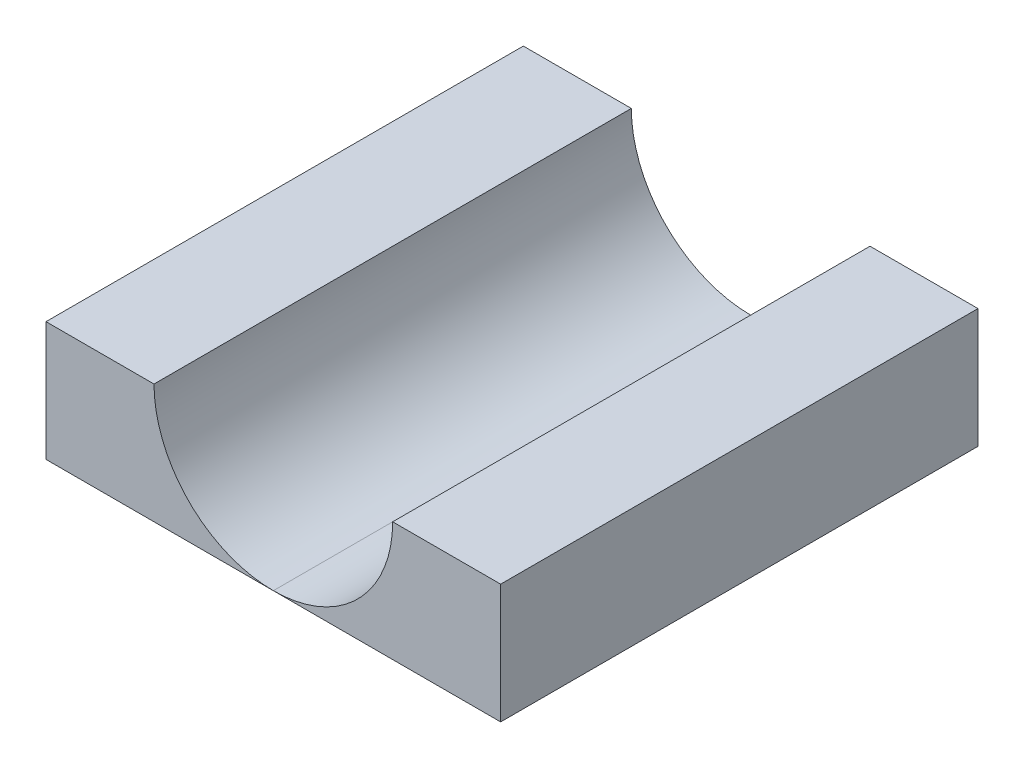
ISO-10303-21;
HEADER;
FILE_DESCRIPTION(('STEP AP214'),'2;1');
FILE_NAME('part.step','',(''),(''),'','','');
FILE_SCHEMA(('AUTOMOTIVE_DESIGN { 1 0 10303 214 1 1 1 1 }'));
ENDSEC;
DATA;
#1=APPLICATION_CONTEXT('core data for automotive mechanical design processes');
#2=APPLICATION_PROTOCOL_DEFINITION('international standard','automotive_design',2000,#1);
#3=PRODUCT_CONTEXT('',#1,'mechanical');
#4=PRODUCT('Part','Part','',(#3));
#5=PRODUCT_RELATED_PRODUCT_CATEGORY('part','',(#4));
#6=PRODUCT_DEFINITION_FORMATION('','',#4);
#7=PRODUCT_DEFINITION_CONTEXT('part definition',#1,'design');
#8=PRODUCT_DEFINITION('design','',#6,#7);
#9=PRODUCT_DEFINITION_SHAPE('','',#8);
#10=(LENGTH_UNIT() NAMED_UNIT(*) SI_UNIT(.MILLI.,.METRE.));
#11=(NAMED_UNIT(*) PLANE_ANGLE_UNIT() SI_UNIT($,.RADIAN.));
#12=(NAMED_UNIT(*) SI_UNIT($,.STERADIAN.) SOLID_ANGLE_UNIT());
#13=UNCERTAINTY_MEASURE_WITH_UNIT(LENGTH_MEASURE(1.E-05),#10,'distance_accuracy_value','');
#14=(GEOMETRIC_REPRESENTATION_CONTEXT(3) GLOBAL_UNCERTAINTY_ASSIGNED_CONTEXT((#13)) GLOBAL_UNIT_ASSIGNED_CONTEXT((#10,
#11,#12)) REPRESENTATION_CONTEXT('',''));
#15=CARTESIAN_POINT('',(0.,0.,0.));
#16=DIRECTION('',(0.,0.,1.));
#17=DIRECTION('',(1.,0.,0.));
#18=AXIS2_PLACEMENT_3D('',#15,#16,#17);
#19=CARTESIAN_POINT('',(9.52500000000001,5.,20.));
#20=DIRECTION('',(0.,0.,-1.));
#21=DIRECTION('',(-1.,0.,0.));
#22=AXIS2_PLACEMENT_3D('',#19,#20,#21);
#23=CYLINDRICAL_SURFACE('',#22,5.);
#24=CARTESIAN_POINT('',(9.52500000000001,5.,0.));
#25=DIRECTION('',(0.,0.,1.));
#26=DIRECTION('',(1.,0.,0.));
#27=AXIS2_PLACEMENT_3D('',#24,#25,#26);
#28=CIRCLE('',#27,5.);
#29=CARTESIAN_POINT('',(9.52500000000001,0.,0.));
#30=VERTEX_POINT('',#29);
#31=CARTESIAN_POINT('',(14.525,5.,0.));
#32=VERTEX_POINT('',#31);
#33=EDGE_CURVE('E107',#30,#32,#28,.T.);
#34=ORIENTED_EDGE('',*,*,#33,.F.);
#35=DIRECTION('',(0.,0.,-1.));
#36=VECTOR('',#35,1.);
#37=CARTESIAN_POINT('',(9.52500000000001,0.,20.));
#38=LINE('',#37,#36);
#39=CARTESIAN_POINT('',(9.52500000000001,0.,20.));
#40=VERTEX_POINT('',#39);
#41=EDGE_CURVE('E12',#40,#30,#38,.T.);
#42=ORIENTED_EDGE('',*,*,#41,.F.);
#43=CARTESIAN_POINT('',(9.52500000000001,5.,20.));
#44=DIRECTION('',(0.,0.,1.));
#45=DIRECTION('',(1.,0.,0.));
#46=AXIS2_PLACEMENT_3D('',#43,#44,#45);
#47=CIRCLE('',#46,5.);
#48=CARTESIAN_POINT('',(14.525,5.,20.));
#49=VERTEX_POINT('',#48);
#50=EDGE_CURVE('E95',#40,#49,#47,.T.);
#51=ORIENTED_EDGE('',*,*,#50,.T.);
#52=DIRECTION('',(0.,0.,-1.));
#53=VECTOR('',#52,1.);
#54=CARTESIAN_POINT('',(14.525,5.,20.));
#55=LINE('',#54,#53);
#56=EDGE_CURVE('E84',#49,#32,#55,.T.);
#57=ORIENTED_EDGE('',*,*,#56,.T.);
#58=EDGE_LOOP('',(#34,#42,#51,#57));
#59=FACE_BOUND('',#58,.T.);
#60=ADVANCED_FACE('F45',(#59),#23,.F.);
#61=CARTESIAN_POINT('',(0.,0.,20.));
#62=DIRECTION('',(0.,1.,0.));
#63=DIRECTION('',(-1.,0.,0.));
#64=AXIS2_PLACEMENT_3D('',#61,#62,#63);
#65=PLANE('',#64);
#66=DIRECTION('',(1.,0.,0.));
#67=VECTOR('',#66,1.);
#68=CARTESIAN_POINT('',(0.,0.,0.));
#69=LINE('',#68,#67);
#70=CARTESIAN_POINT('',(19.05,0.,0.));
#71=VERTEX_POINT('',#70);
#72=EDGE_CURVE('E100',#30,#71,#69,.T.);
#73=ORIENTED_EDGE('',*,*,#72,.T.);
#74=DIRECTION('',(0.,0.,-1.));
#75=VECTOR('',#74,1.);
#76=CARTESIAN_POINT('',(19.05,0.,20.));
#77=LINE('',#76,#75);
#78=CARTESIAN_POINT('',(19.05,0.,20.));
#79=VERTEX_POINT('',#78);
#80=EDGE_CURVE('E53',#79,#71,#77,.T.);
#81=ORIENTED_EDGE('',*,*,#80,.F.);
#82=DIRECTION('',(1.,0.,0.));
#83=VECTOR('',#82,1.);
#84=CARTESIAN_POINT('',(0.,0.,20.));
#85=LINE('',#84,#83);
#86=EDGE_CURVE('E90',#40,#79,#85,.T.);
#87=ORIENTED_EDGE('',*,*,#86,.F.);
#88=ORIENTED_EDGE('',*,*,#41,.T.);
#89=EDGE_LOOP('',(#73,#81,#87,#88));
#90=FACE_BOUND('',#89,.T.);
#91=ADVANCED_FACE('F98',(#90),#65,.F.);
#92=CARTESIAN_POINT('',(19.05,0.,20.));
#93=DIRECTION('',(-1.,0.,0.));
#94=DIRECTION('',(0.,-1.,0.));
#95=AXIS2_PLACEMENT_3D('',#92,#93,#94);
#96=PLANE('',#95);
#97=DIRECTION('',(0.,1.,0.));
#98=VECTOR('',#97,1.);
#99=CARTESIAN_POINT('',(19.05,0.,0.));
#100=LINE('',#99,#98);
#101=CARTESIAN_POINT('',(19.05,5.,0.));
#102=VERTEX_POINT('',#101);
#103=EDGE_CURVE('E77',#71,#102,#100,.T.);
#104=ORIENTED_EDGE('',*,*,#103,.T.);
#105=DIRECTION('',(0.,0.,-1.));
#106=VECTOR('',#105,1.);
#107=CARTESIAN_POINT('',(19.05,5.,20.));
#108=LINE('',#107,#106);
#109=CARTESIAN_POINT('',(19.05,5.,20.));
#110=VERTEX_POINT('',#109);
#111=EDGE_CURVE('E101',#110,#102,#108,.T.);
#112=ORIENTED_EDGE('',*,*,#111,.F.);
#113=DIRECTION('',(0.,1.,0.));
#114=VECTOR('',#113,1.);
#115=CARTESIAN_POINT('',(19.05,0.,20.));
#116=LINE('',#115,#114);
#117=EDGE_CURVE('E94',#79,#110,#116,.T.);
#118=ORIENTED_EDGE('',*,*,#117,.F.);
#119=ORIENTED_EDGE('',*,*,#80,.T.);
#120=EDGE_LOOP('',(#104,#112,#118,#119));
#121=FACE_BOUND('',#120,.T.);
#122=ADVANCED_FACE('F102',(#121),#96,.F.);
#123=CARTESIAN_POINT('',(0.,5.,20.));
#124=DIRECTION('',(0.,-1.,0.));
#125=DIRECTION('',(1.,0.,0.));
#126=AXIS2_PLACEMENT_3D('',#123,#124,#125);
#127=PLANE('',#126);
#128=DIRECTION('',(-1.,0.,0.));
#129=VECTOR('',#128,1.);
#130=CARTESIAN_POINT('',(0.,5.,0.));
#131=LINE('',#130,#129);
#132=EDGE_CURVE('E112',#102,#32,#131,.T.);
#133=ORIENTED_EDGE('',*,*,#132,.T.);
#134=ORIENTED_EDGE('',*,*,#56,.F.);
#135=DIRECTION('',(-1.,0.,0.));
#136=VECTOR('',#135,1.);
#137=CARTESIAN_POINT('',(0.,5.,20.));
#138=LINE('',#137,#136);
#139=EDGE_CURVE('E61',#110,#49,#138,.T.);
#140=ORIENTED_EDGE('',*,*,#139,.F.);
#141=ORIENTED_EDGE('',*,*,#111,.T.);
#142=EDGE_LOOP('',(#133,#134,#140,#141));
#143=FACE_BOUND('',#142,.T.);
#144=ADVANCED_FACE('F117',(#143),#127,.F.);
#145=CARTESIAN_POINT('',(0.,0.,20.));
#146=DIRECTION('',(0.,0.,1.));
#147=DIRECTION('',(1.,0.,0.));
#148=AXIS2_PLACEMENT_3D('',#145,#146,#147);
#149=PLANE('',#148);
#150=ORIENTED_EDGE('',*,*,#50,.F.);
#151=ORIENTED_EDGE('',*,*,#86,.T.);
#152=ORIENTED_EDGE('',*,*,#117,.T.);
#153=ORIENTED_EDGE('',*,*,#139,.T.);
#154=EDGE_LOOP('',(#150,#151,#152,#153));
#155=FACE_BOUND('',#154,.T.);
#156=ADVANCED_FACE('F92',(#155),#149,.T.);
#157=CARTESIAN_POINT('',(0.,0.,0.));
#158=DIRECTION('',(0.,0.,1.));
#159=DIRECTION('',(1.,0.,0.));
#160=AXIS2_PLACEMENT_3D('',#157,#158,#159);
#161=PLANE('',#160);
#162=ORIENTED_EDGE('',*,*,#33,.T.);
#163=ORIENTED_EDGE('',*,*,#132,.F.);
#164=ORIENTED_EDGE('',*,*,#103,.F.);
#165=ORIENTED_EDGE('',*,*,#72,.F.);
#166=EDGE_LOOP('',(#162,#163,#164,#165));
#167=FACE_BOUND('',#166,.T.);
#168=ADVANCED_FACE('F119',(#167),#161,.F.);
#169=CLOSED_SHELL('',(#60,#91,#122,#144,#156,#168));
#170=MANIFOLD_SOLID_BREP('B2',#169);
#171=CARTESIAN_POINT('',(9.52500000000001,5.,20.));
#172=DIRECTION('',(0.,0.,-1.));
#173=DIRECTION('',(-1.,0.,0.));
#174=AXIS2_PLACEMENT_3D('',#171,#172,#173);
#175=CYLINDRICAL_SURFACE('',#174,5.);
#176=CARTESIAN_POINT('',(9.52500000000001,5.,0.));
#177=DIRECTION('',(0.,0.,1.));
#178=DIRECTION('',(1.,0.,0.));
#179=AXIS2_PLACEMENT_3D('',#176,#177,#178);
#180=CIRCLE('',#179,5.);
#181=CARTESIAN_POINT('',(4.525,5.,0.));
#182=VERTEX_POINT('',#181);
#183=CARTESIAN_POINT('',(9.52500000000001,0.,0.));
#184=VERTEX_POINT('',#183);
#185=EDGE_CURVE('E231',#182,#184,#180,.T.);
#186=ORIENTED_EDGE('',*,*,#185,.F.);
#187=DIRECTION('',(0.,0.,-1.));
#188=VECTOR('',#187,1.);
#189=CARTESIAN_POINT('',(4.525,5.,20.));
#190=LINE('',#189,#188);
#191=CARTESIAN_POINT('',(4.525,5.,20.));
#192=VERTEX_POINT('',#191);
#193=EDGE_CURVE('E43',#192,#182,#190,.T.);
#194=ORIENTED_EDGE('',*,*,#193,.F.);
#195=CARTESIAN_POINT('',(9.52500000000001,5.,20.));
#196=DIRECTION('',(0.,0.,1.));
#197=DIRECTION('',(1.,0.,0.));
#198=AXIS2_PLACEMENT_3D('',#195,#196,#197);
#199=CIRCLE('',#198,5.);
#200=CARTESIAN_POINT('',(9.52500000000001,0.,20.));
#201=VERTEX_POINT('',#200);
#202=EDGE_CURVE('E219',#192,#201,#199,.T.);
#203=ORIENTED_EDGE('',*,*,#202,.T.);
#204=DIRECTION('',(0.,0.,-1.));
#205=VECTOR('',#204,1.);
#206=CARTESIAN_POINT('',(9.52500000000001,0.,20.));
#207=LINE('',#206,#205);
#208=EDGE_CURVE('E208',#201,#184,#207,.T.);
#209=ORIENTED_EDGE('',*,*,#208,.T.);
#210=EDGE_LOOP('',(#186,#194,#203,#209));
#211=FACE_BOUND('',#210,.T.);
#212=ADVANCED_FACE('F169',(#211),#175,.F.);
#213=CARTESIAN_POINT('',(0.,5.,20.));
#214=DIRECTION('',(0.,-1.,0.));
#215=DIRECTION('',(1.,0.,0.));
#216=AXIS2_PLACEMENT_3D('',#213,#214,#215);
#217=PLANE('',#216);
#218=DIRECTION('',(-1.,0.,0.));
#219=VECTOR('',#218,1.);
#220=CARTESIAN_POINT('',(0.,5.,0.));
#221=LINE('',#220,#219);
#222=CARTESIAN_POINT('',(0.,5.,0.));
#223=VERTEX_POINT('',#222);
#224=EDGE_CURVE('E224',#182,#223,#221,.T.);
#225=ORIENTED_EDGE('',*,*,#224,.T.);
#226=DIRECTION('',(0.,0.,-1.));
#227=VECTOR('',#226,1.);
#228=CARTESIAN_POINT('',(0.,5.,20.));
#229=LINE('',#228,#227);
#230=CARTESIAN_POINT('',(0.,5.,20.));
#231=VERTEX_POINT('',#230);
#232=EDGE_CURVE('E177',#231,#223,#229,.T.);
#233=ORIENTED_EDGE('',*,*,#232,.F.);
#234=DIRECTION('',(-1.,0.,0.));
#235=VECTOR('',#234,1.);
#236=CARTESIAN_POINT('',(0.,5.,20.));
#237=LINE('',#236,#235);
#238=EDGE_CURVE('E214',#192,#231,#237,.T.);
#239=ORIENTED_EDGE('',*,*,#238,.F.);
#240=ORIENTED_EDGE('',*,*,#193,.T.);
#241=EDGE_LOOP('',(#225,#233,#239,#240));
#242=FACE_BOUND('',#241,.T.);
#243=ADVANCED_FACE('F222',(#242),#217,.F.);
#244=CARTESIAN_POINT('',(0.,0.,20.));
#245=DIRECTION('',(1.,0.,0.));
#246=DIRECTION('',(0.,1.,0.));
#247=AXIS2_PLACEMENT_3D('',#244,#245,#246);
#248=PLANE('',#247);
#249=DIRECTION('',(0.,-1.,0.));
#250=VECTOR('',#249,1.);
#251=CARTESIAN_POINT('',(0.,0.,0.));
#252=LINE('',#251,#250);
#253=CARTESIAN_POINT('',(0.,0.,0.));
#254=VERTEX_POINT('',#253);
#255=EDGE_CURVE('E201',#223,#254,#252,.T.);
#256=ORIENTED_EDGE('',*,*,#255,.T.);
#257=DIRECTION('',(0.,0.,-1.));
#258=VECTOR('',#257,1.);
#259=CARTESIAN_POINT('',(0.,0.,20.));
#260=LINE('',#259,#258);
#261=CARTESIAN_POINT('',(0.,0.,20.));
#262=VERTEX_POINT('',#261);
#263=EDGE_CURVE('E225',#262,#254,#260,.T.);
#264=ORIENTED_EDGE('',*,*,#263,.F.);
#265=DIRECTION('',(0.,-1.,0.));
#266=VECTOR('',#265,1.);
#267=CARTESIAN_POINT('',(0.,0.,20.));
#268=LINE('',#267,#266);
#269=EDGE_CURVE('E218',#231,#262,#268,.T.);
#270=ORIENTED_EDGE('',*,*,#269,.F.);
#271=ORIENTED_EDGE('',*,*,#232,.T.);
#272=EDGE_LOOP('',(#256,#264,#270,#271));
#273=FACE_BOUND('',#272,.T.);
#274=ADVANCED_FACE('F226',(#273),#248,.F.);
#275=CARTESIAN_POINT('',(0.,0.,20.));
#276=DIRECTION('',(0.,1.,0.));
#277=DIRECTION('',(-1.,0.,0.));
#278=AXIS2_PLACEMENT_3D('',#275,#276,#277);
#279=PLANE('',#278);
#280=DIRECTION('',(1.,0.,0.));
#281=VECTOR('',#280,1.);
#282=CARTESIAN_POINT('',(0.,0.,0.));
#283=LINE('',#282,#281);
#284=EDGE_CURVE('E236',#254,#184,#283,.T.);
#285=ORIENTED_EDGE('',*,*,#284,.T.);
#286=ORIENTED_EDGE('',*,*,#208,.F.);
#287=DIRECTION('',(1.,0.,0.));
#288=VECTOR('',#287,1.);
#289=CARTESIAN_POINT('',(0.,0.,20.));
#290=LINE('',#289,#288);
#291=EDGE_CURVE('E185',#262,#201,#290,.T.);
#292=ORIENTED_EDGE('',*,*,#291,.F.);
#293=ORIENTED_EDGE('',*,*,#263,.T.);
#294=EDGE_LOOP('',(#285,#286,#292,#293));
#295=FACE_BOUND('',#294,.T.);
#296=ADVANCED_FACE('F241',(#295),#279,.F.);
#297=CARTESIAN_POINT('',(0.,0.,20.));
#298=DIRECTION('',(0.,0.,1.));
#299=DIRECTION('',(1.,0.,0.));
#300=AXIS2_PLACEMENT_3D('',#297,#298,#299);
#301=PLANE('',#300);
#302=ORIENTED_EDGE('',*,*,#202,.F.);
#303=ORIENTED_EDGE('',*,*,#238,.T.);
#304=ORIENTED_EDGE('',*,*,#269,.T.);
#305=ORIENTED_EDGE('',*,*,#291,.T.);
#306=EDGE_LOOP('',(#302,#303,#304,#305));
#307=FACE_BOUND('',#306,.T.);
#308=ADVANCED_FACE('F216',(#307),#301,.T.);
#309=CARTESIAN_POINT('',(0.,0.,0.));
#310=DIRECTION('',(0.,0.,1.));
#311=DIRECTION('',(1.,0.,0.));
#312=AXIS2_PLACEMENT_3D('',#309,#310,#311);
#313=PLANE('',#312);
#314=ORIENTED_EDGE('',*,*,#185,.T.);
#315=ORIENTED_EDGE('',*,*,#284,.F.);
#316=ORIENTED_EDGE('',*,*,#255,.F.);
#317=ORIENTED_EDGE('',*,*,#224,.F.);
#318=EDGE_LOOP('',(#314,#315,#316,#317));
#319=FACE_BOUND('',#318,.T.);
#320=ADVANCED_FACE('F243',(#319),#313,.F.);
#321=CLOSED_SHELL('',(#212,#243,#274,#296,#308,#320));
#322=MANIFOLD_SOLID_BREP('B6',#321);
#323=ADVANCED_BREP_SHAPE_REPRESENTATION('',(#18,#170,#322),#14);
#324=SHAPE_DEFINITION_REPRESENTATION(#9,#323);
ENDSEC;
END-ISO-10303-21;
